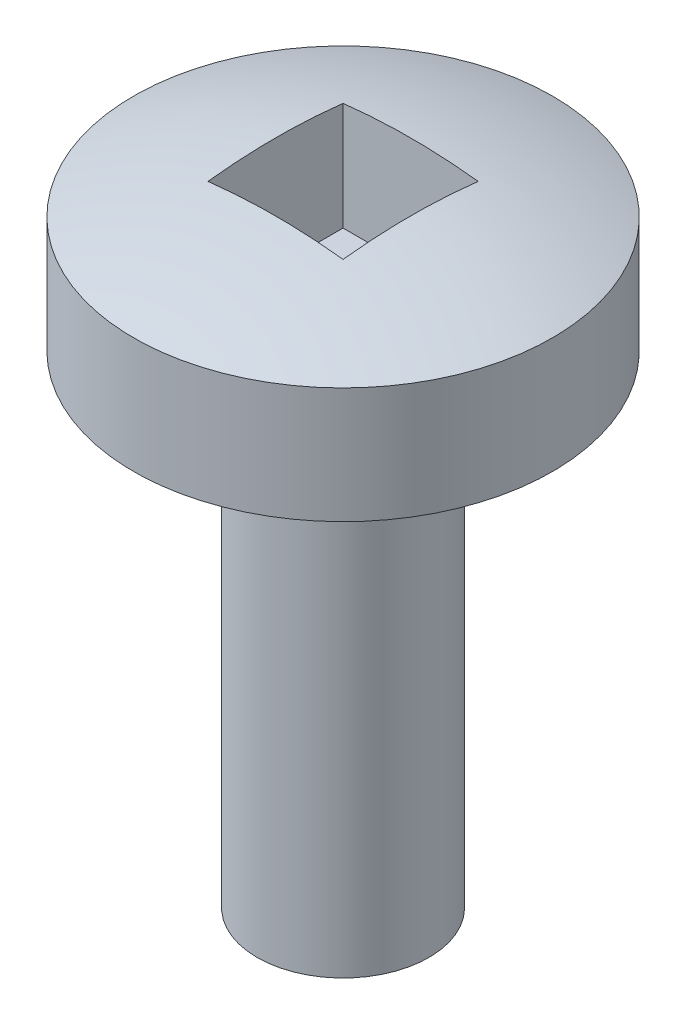
ISO-10303-21;
HEADER;
FILE_DESCRIPTION(('STEP AP214'),'2;1');
FILE_NAME('part.step','',(''),(''),'','','');
FILE_SCHEMA(('AUTOMOTIVE_DESIGN { 1 0 10303 214 1 1 1 1 }'));
ENDSEC;
DATA;
#1=APPLICATION_CONTEXT('core data for automotive mechanical design processes');
#2=APPLICATION_PROTOCOL_DEFINITION('international standard','automotive_design',2000,#1);
#3=PRODUCT_CONTEXT('',#1,'mechanical');
#4=PRODUCT('Part','Part','',(#3));
#5=PRODUCT_RELATED_PRODUCT_CATEGORY('part','',(#4));
#6=PRODUCT_DEFINITION_FORMATION('','',#4);
#7=PRODUCT_DEFINITION_CONTEXT('part definition',#1,'design');
#8=PRODUCT_DEFINITION('design','',#6,#7);
#9=PRODUCT_DEFINITION_SHAPE('','',#8);
#10=(LENGTH_UNIT() NAMED_UNIT(*) SI_UNIT(.MILLI.,.METRE.));
#11=(NAMED_UNIT(*) PLANE_ANGLE_UNIT() SI_UNIT($,.RADIAN.));
#12=(NAMED_UNIT(*) SI_UNIT($,.STERADIAN.) SOLID_ANGLE_UNIT());
#13=UNCERTAINTY_MEASURE_WITH_UNIT(LENGTH_MEASURE(1.E-05),#10,'distance_accuracy_value','');
#14=(GEOMETRIC_REPRESENTATION_CONTEXT(3) GLOBAL_UNCERTAINTY_ASSIGNED_CONTEXT((#13)) GLOBAL_UNIT_ASSIGNED_CONTEXT((#10,
#11,#12)) REPRESENTATION_CONTEXT('',''));
#15=CARTESIAN_POINT('',(0.,0.,0.));
#16=DIRECTION('',(0.,0.,1.));
#17=DIRECTION('',(1.,0.,0.));
#18=AXIS2_PLACEMENT_3D('',#15,#16,#17);
#19=CARTESIAN_POINT('',(0.,-6.35,0.));
#20=DIRECTION('',(0.,1.,0.));
#21=DIRECTION('',(0.,0.,1.));
#22=AXIS2_PLACEMENT_3D('',#19,#20,#21);
#23=CYLINDRICAL_SURFACE('',#22,1.1303);
#24=CARTESIAN_POINT('',(0.,-6.35,0.));
#25=DIRECTION('',(0.,1.,0.));
#26=DIRECTION('',(0.,0.,1.));
#27=AXIS2_PLACEMENT_3D('',#24,#25,#26);
#28=CIRCLE('',#27,1.1303);
#29=CARTESIAN_POINT('',(0.,-6.35,1.1303));
#30=VERTEX_POINT('',#29);
#31=EDGE_CURVE('E105',#30,#30,#28,.T.);
#32=ORIENTED_EDGE('',*,*,#31,.T.);
#33=EDGE_LOOP('',(#32));
#34=FACE_BOUND('',#33,.T.);
#35=CARTESIAN_POINT('',(0.,0.,0.));
#36=DIRECTION('',(0.,1.,0.));
#37=DIRECTION('',(0.,0.,1.));
#38=AXIS2_PLACEMENT_3D('',#35,#36,#37);
#39=CIRCLE('',#38,1.1303);
#40=CARTESIAN_POINT('',(0.,0.,1.1303));
#41=VERTEX_POINT('',#40);
#42=EDGE_CURVE('E109',#41,#41,#39,.T.);
#43=ORIENTED_EDGE('',*,*,#42,.F.);
#44=EDGE_LOOP('',(#43));
#45=FACE_BOUND('',#44,.T.);
#46=ADVANCED_FACE('F33',(#34,#45),#23,.T.);
#47=CARTESIAN_POINT('',(0.,-6.35,0.));
#48=DIRECTION('',(0.,1.,0.));
#49=DIRECTION('',(0.,0.,1.));
#50=AXIS2_PLACEMENT_3D('',#47,#48,#49);
#51=PLANE('',#50);
#52=ORIENTED_EDGE('',*,*,#31,.F.);
#53=EDGE_LOOP('',(#52));
#54=FACE_BOUND('',#53,.T.);
#55=ADVANCED_FACE('F129',(#54),#51,.F.);
#56=CARTESIAN_POINT('',(0.,1.524,0.));
#57=DIRECTION('',(0.,-1.,0.));
#58=DIRECTION('',(0.,0.,-1.));
#59=AXIS2_PLACEMENT_3D('',#56,#57,#58);
#60=CYLINDRICAL_SURFACE('',#59,2.7559);
#61=CARTESIAN_POINT('',(0.,1.524,0.));
#62=DIRECTION('',(0.,1.,0.));
#63=DIRECTION('',(0.,0.,1.));
#64=AXIS2_PLACEMENT_3D('',#61,#62,#63);
#65=CIRCLE('',#64,2.7559);
#66=CARTESIAN_POINT('',(0.,1.524,-2.7559));
#67=VERTEX_POINT('',#66);
#68=EDGE_CURVE('E104',#67,#67,#65,.T.);
#69=CARTESIAN_POINT('',(0.,0.,0.));
#70=DIRECTION('',(0.,1.,0.));
#71=DIRECTION('',(0.,0.,1.));
#72=AXIS2_PLACEMENT_3D('',#69,#70,#71);
#73=CIRCLE('',#72,2.7559);
#74=CARTESIAN_POINT('',(0.,0.,-2.7559));
#75=VERTEX_POINT('',#74);
#76=EDGE_CURVE('E98',#75,#75,#73,.T.);
#77=CARTESIAN_POINT('',(0.,1.524,-2.7559));
#78=CARTESIAN_POINT('',(0.,1.508125,-2.7559));
#79=CARTESIAN_POINT('',(0.,1.49225,-2.7559));
#80=CARTESIAN_POINT('',(0.,1.4605,-2.7559));
#81=CARTESIAN_POINT('',(0.,1.444625,-2.7559));
#82=CARTESIAN_POINT('',(0.,1.412875,-2.7559));
#83=CARTESIAN_POINT('',(0.,1.397,-2.7559));
#84=CARTESIAN_POINT('',(0.,1.36525,-2.7559));
#85=CARTESIAN_POINT('',(0.,1.349375,-2.7559));
#86=CARTESIAN_POINT('',(0.,1.317625,-2.7559));
#87=CARTESIAN_POINT('',(0.,1.30175,-2.7559));
#88=CARTESIAN_POINT('',(0.,1.27,-2.7559));
#89=CARTESIAN_POINT('',(0.,1.254125,-2.7559));
#90=CARTESIAN_POINT('',(0.,1.222375,-2.7559));
#91=CARTESIAN_POINT('',(0.,1.2065,-2.7559));
#92=CARTESIAN_POINT('',(0.,1.17475,-2.7559));
#93=CARTESIAN_POINT('',(0.,1.158875,-2.7559));
#94=CARTESIAN_POINT('',(0.,1.127125,-2.7559));
#95=CARTESIAN_POINT('',(0.,1.11125,-2.7559));
#96=CARTESIAN_POINT('',(0.,1.0795,-2.7559));
#97=CARTESIAN_POINT('',(0.,1.063625,-2.7559));
#98=CARTESIAN_POINT('',(0.,1.031875,-2.7559));
#99=CARTESIAN_POINT('',(0.,1.016,-2.7559));
#100=CARTESIAN_POINT('',(0.,0.98425,-2.7559));
#101=CARTESIAN_POINT('',(0.,0.968375,-2.7559));
#102=CARTESIAN_POINT('',(0.,0.936625,-2.7559));
#103=CARTESIAN_POINT('',(0.,0.92075,-2.7559));
#104=CARTESIAN_POINT('',(0.,0.889,-2.7559));
#105=CARTESIAN_POINT('',(0.,0.873125,-2.7559));
#106=CARTESIAN_POINT('',(0.,0.841375,-2.7559));
#107=CARTESIAN_POINT('',(0.,0.8255,-2.7559));
#108=CARTESIAN_POINT('',(0.,0.79375,-2.7559));
#109=CARTESIAN_POINT('',(0.,0.777875,-2.7559));
#110=CARTESIAN_POINT('',(0.,0.746125,-2.7559));
#111=CARTESIAN_POINT('',(0.,0.73025,-2.7559));
#112=CARTESIAN_POINT('',(0.,0.6985,-2.7559));
#113=CARTESIAN_POINT('',(0.,0.682625,-2.7559));
#114=CARTESIAN_POINT('',(0.,0.650875,-2.7559));
#115=CARTESIAN_POINT('',(0.,0.635,-2.7559));
#116=CARTESIAN_POINT('',(0.,0.60325,-2.7559));
#117=CARTESIAN_POINT('',(0.,0.587375,-2.7559));
#118=CARTESIAN_POINT('',(0.,0.555625,-2.7559));
#119=CARTESIAN_POINT('',(0.,0.53975,-2.7559));
#120=CARTESIAN_POINT('',(0.,0.508,-2.7559));
#121=CARTESIAN_POINT('',(0.,0.492125,-2.7559));
#122=CARTESIAN_POINT('',(0.,0.460375,-2.7559));
#123=CARTESIAN_POINT('',(0.,0.4445,-2.7559));
#124=CARTESIAN_POINT('',(0.,0.41275,-2.7559));
#125=CARTESIAN_POINT('',(0.,0.396875,-2.7559));
#126=CARTESIAN_POINT('',(0.,0.365125,-2.7559));
#127=CARTESIAN_POINT('',(0.,0.34925,-2.7559));
#128=CARTESIAN_POINT('',(0.,0.3175,-2.7559));
#129=CARTESIAN_POINT('',(0.,0.301625,-2.7559));
#130=CARTESIAN_POINT('',(0.,0.269875,-2.7559));
#131=CARTESIAN_POINT('',(0.,0.254,-2.7559));
#132=CARTESIAN_POINT('',(0.,0.22225,-2.7559));
#133=CARTESIAN_POINT('',(0.,0.206375,-2.7559));
#134=CARTESIAN_POINT('',(0.,0.174625,-2.7559));
#135=CARTESIAN_POINT('',(0.,0.15875,-2.7559));
#136=CARTESIAN_POINT('',(0.,0.127,-2.7559));
#137=CARTESIAN_POINT('',(0.,0.111125,-2.7559));
#138=CARTESIAN_POINT('',(0.,0.079375,-2.7559));
#139=CARTESIAN_POINT('',(0.,0.0635,-2.7559));
#140=CARTESIAN_POINT('',(0.,0.0317499999999999,-2.7559));
#141=CARTESIAN_POINT('',(0.,0.015875,-2.7559));
#142=CARTESIAN_POINT('',(0.,0.,-2.7559));
#143=B_SPLINE_CURVE_WITH_KNOTS('',3,(#77,#78,#79,#80,#81,#82,#83,#84,#85,#86,#87,#88,#89,#90,
#91,#92,#93,#94,#95,#96,#97,#98,#99,#100,#101,#102,#103,#104,#105,#106,#107,#108,#109,#110,#111,
#112,#113,#114,#115,#116,#117,#118,#119,#120,#121,#122,#123,#124,#125,#126,#127,#128,#129,#130,
#131,#132,#133,#134,#135,#136,#137,#138,#139,#140,#141,#142),.UNSPECIFIED.,.F.,.F.,(4,2,2,2,2,2,
2,2,2,2,2,2,2,2,2,2,2,2,2,2,2,2,2,2,2,2,2,2,2,2,2,2,4),(0.,0.0476250000000001,
0.0952500000000001,0.142875,0.1905,0.238125,0.28575,0.333375,0.381,0.428625,0.47625,0.523875,
0.5715,0.619125,0.66675,0.714375,0.762,0.809625,0.85725,0.904875,0.9525,1.000125,1.04775,
1.095375,1.143,1.190625,1.23825,1.285875,1.3335,1.381125,1.42875,1.476375,1.524),.UNSPECIFIED.);
#144=EDGE_CURVE('BSEAM124',#67,#75,#143,.T.);
#145=ORIENTED_EDGE('',*,*,#68,.F.);
#146=ORIENTED_EDGE('',*,*,#76,.T.);
#147=ORIENTED_EDGE('',*,*,#144,.T.);
#148=ORIENTED_EDGE('',*,*,#144,.F.);
#149=EDGE_LOOP('',(#145,#147,#146,#148));
#150=FACE_BOUND('',#149,.T.);
#151=ADVANCED_FACE('F124',(#150),#60,.T.);
#152=CARTESIAN_POINT('',(0.,-5.69737875,0.));
#153=DIRECTION('',(0.,0.,1.));
#154=DIRECTION('',(1.,0.,0.));
#155=AXIS2_PLACEMENT_3D('',#152,#153,#154);
#156=SPHERICAL_SURFACE('',#155,7.72937875);
#157=CARTESIAN_POINT('',(0.889,-5.69737875,0.));
#158=DIRECTION('',(1.,0.,0.));
#159=DIRECTION('',(0.,0.,-1.));
#160=AXIS2_PLACEMENT_3D('',#157,#158,#159);
#161=CIRCLE('',#160,7.67808406185759);
#162=CARTESIAN_POINT('',(0.889,1.92906562867028,0.889));
#163=VERTEX_POINT('',#162);
#164=CARTESIAN_POINT('',(0.889,1.92906562867028,-0.889));
#165=VERTEX_POINT('',#164);
#166=EDGE_CURVE('E11',#163,#165,#161,.F.);
#167=ORIENTED_EDGE('',*,*,#166,.F.);
#168=CARTESIAN_POINT('',(0.,-5.69737875,0.889));
#169=DIRECTION('',(0.,0.,1.));
#170=DIRECTION('',(1.,0.,0.));
#171=AXIS2_PLACEMENT_3D('',#168,#169,#170);
#172=CIRCLE('',#171,7.67808406185759);
#173=CARTESIAN_POINT('',(-0.889,1.92906562867028,0.888999999999999));
#174=VERTEX_POINT('',#173);
#175=EDGE_CURVE('E41',#174,#163,#172,.F.);
#176=ORIENTED_EDGE('',*,*,#175,.F.);
#177=CARTESIAN_POINT('',(-0.889,-5.69737875,0.));
#178=DIRECTION('',(-1.,0.,0.));
#179=DIRECTION('',(0.,0.,1.));
#180=AXIS2_PLACEMENT_3D('',#177,#178,#179);
#181=CIRCLE('',#180,7.67808406185759);
#182=CARTESIAN_POINT('',(-0.888999999999999,1.92906562867028,-0.889));
#183=VERTEX_POINT('',#182);
#184=EDGE_CURVE('E115',#183,#174,#181,.F.);
#185=ORIENTED_EDGE('',*,*,#184,.F.);
#186=CARTESIAN_POINT('',(0.,-5.69737875,-0.889));
#187=DIRECTION('',(0.,0.,-1.));
#188=DIRECTION('',(-1.,0.,0.));
#189=AXIS2_PLACEMENT_3D('',#186,#187,#188);
#190=CIRCLE('',#189,7.67808406185759);
#191=EDGE_CURVE('E108',#165,#183,#190,.F.);
#192=ORIENTED_EDGE('',*,*,#191,.F.);
#193=EDGE_LOOP('',(#167,#176,#185,#192));
#194=FACE_BOUND('',#193,.T.);
#195=ORIENTED_EDGE('',*,*,#68,.T.);
#196=EDGE_LOOP('',(#195));
#197=FACE_BOUND('',#196,.T.);
#198=ADVANCED_FACE('F35',(#194,#197),#156,.T.);
#199=CARTESIAN_POINT('',(0.,0.,0.));
#200=DIRECTION('',(0.,1.,0.));
#201=DIRECTION('',(0.,0.,1.));
#202=AXIS2_PLACEMENT_3D('',#199,#200,#201);
#203=PLANE('',#202);
#204=ORIENTED_EDGE('',*,*,#42,.T.);
#205=EDGE_LOOP('',(#204));
#206=FACE_BOUND('',#205,.T.);
#207=ORIENTED_EDGE('',*,*,#76,.F.);
#208=EDGE_LOOP('',(#207));
#209=FACE_BOUND('',#208,.T.);
#210=ADVANCED_FACE('F123',(#206,#209),#203,.F.);
#211=CARTESIAN_POINT('',(0.889,0.508,0.889));
#212=DIRECTION('',(1.,0.,0.));
#213=DIRECTION('',(0.,0.,-1.));
#214=AXIS2_PLACEMENT_3D('',#211,#212,#213);
#215=PLANE('',#214);
#216=ORIENTED_EDGE('',*,*,#166,.T.);
#217=DIRECTION('',(0.,1.,0.));
#218=VECTOR('',#217,1.);
#219=CARTESIAN_POINT('',(0.889,0.508,-0.889));
#220=LINE('',#219,#218);
#221=CARTESIAN_POINT('',(0.889,0.508,-0.889));
#222=VERTEX_POINT('',#221);
#223=EDGE_CURVE('E48',#222,#165,#220,.T.);
#224=ORIENTED_EDGE('',*,*,#223,.F.);
#225=DIRECTION('',(0.,0.,-1.));
#226=VECTOR('',#225,1.);
#227=CARTESIAN_POINT('',(0.889,0.508,0.889));
#228=LINE('',#227,#226);
#229=CARTESIAN_POINT('',(0.889,0.508,0.889));
#230=VERTEX_POINT('',#229);
#231=EDGE_CURVE('E74',#230,#222,#228,.T.);
#232=ORIENTED_EDGE('',*,*,#231,.F.);
#233=DIRECTION('',(0.,1.,0.));
#234=VECTOR('',#233,1.);
#235=CARTESIAN_POINT('',(0.889,0.508,0.889));
#236=LINE('',#235,#234);
#237=EDGE_CURVE('E96',#230,#163,#236,.T.);
#238=ORIENTED_EDGE('',*,*,#237,.T.);
#239=EDGE_LOOP('',(#216,#224,#232,#238));
#240=FACE_BOUND('',#239,.T.);
#241=ADVANCED_FACE('F72',(#240),#215,.F.);
#242=CARTESIAN_POINT('',(-0.889,0.508,0.889));
#243=DIRECTION('',(0.,0.,1.));
#244=DIRECTION('',(1.,0.,0.));
#245=AXIS2_PLACEMENT_3D('',#242,#243,#244);
#246=PLANE('',#245);
#247=ORIENTED_EDGE('',*,*,#175,.T.);
#248=ORIENTED_EDGE('',*,*,#237,.F.);
#249=DIRECTION('',(1.,0.,0.));
#250=VECTOR('',#249,1.);
#251=CARTESIAN_POINT('',(-0.889,0.508,0.889));
#252=LINE('',#251,#250);
#253=CARTESIAN_POINT('',(-0.889,0.508,0.889));
#254=VERTEX_POINT('',#253);
#255=EDGE_CURVE('E79',#254,#230,#252,.T.);
#256=ORIENTED_EDGE('',*,*,#255,.F.);
#257=DIRECTION('',(0.,1.,0.));
#258=VECTOR('',#257,1.);
#259=CARTESIAN_POINT('',(-0.889,0.508,0.889));
#260=LINE('',#259,#258);
#261=EDGE_CURVE('E99',#254,#174,#260,.T.);
#262=ORIENTED_EDGE('',*,*,#261,.T.);
#263=EDGE_LOOP('',(#247,#248,#256,#262));
#264=FACE_BOUND('',#263,.T.);
#265=ADVANCED_FACE('F120',(#264),#246,.F.);
#266=CARTESIAN_POINT('',(-0.889,0.508,0.889));
#267=DIRECTION('',(-1.,0.,0.));
#268=DIRECTION('',(0.,0.,1.));
#269=AXIS2_PLACEMENT_3D('',#266,#267,#268);
#270=PLANE('',#269);
#271=ORIENTED_EDGE('',*,*,#184,.T.);
#272=ORIENTED_EDGE('',*,*,#261,.F.);
#273=DIRECTION('',(0.,0.,1.));
#274=VECTOR('',#273,1.);
#275=CARTESIAN_POINT('',(-0.889,0.508,0.889));
#276=LINE('',#275,#274);
#277=CARTESIAN_POINT('',(-0.889,0.508,-0.889));
#278=VERTEX_POINT('',#277);
#279=EDGE_CURVE('E88',#278,#254,#276,.T.);
#280=ORIENTED_EDGE('',*,*,#279,.F.);
#281=DIRECTION('',(0.,1.,0.));
#282=VECTOR('',#281,1.);
#283=CARTESIAN_POINT('',(-0.889,0.508,-0.889));
#284=LINE('',#283,#282);
#285=EDGE_CURVE('E78',#278,#183,#284,.T.);
#286=ORIENTED_EDGE('',*,*,#285,.T.);
#287=EDGE_LOOP('',(#271,#272,#280,#286));
#288=FACE_BOUND('',#287,.T.);
#289=ADVANCED_FACE('F118',(#288),#270,.F.);
#290=CARTESIAN_POINT('',(-0.889,0.508,-0.889));
#291=DIRECTION('',(0.,0.,-1.));
#292=DIRECTION('',(-1.,0.,0.));
#293=AXIS2_PLACEMENT_3D('',#290,#291,#292);
#294=PLANE('',#293);
#295=ORIENTED_EDGE('',*,*,#191,.T.);
#296=ORIENTED_EDGE('',*,*,#285,.F.);
#297=DIRECTION('',(-1.,0.,0.));
#298=VECTOR('',#297,1.);
#299=CARTESIAN_POINT('',(-0.889,0.508,-0.889));
#300=LINE('',#299,#298);
#301=EDGE_CURVE('E82',#222,#278,#300,.T.);
#302=ORIENTED_EDGE('',*,*,#301,.F.);
#303=ORIENTED_EDGE('',*,*,#223,.T.);
#304=EDGE_LOOP('',(#295,#296,#302,#303));
#305=FACE_BOUND('',#304,.T.);
#306=ADVANCED_FACE('F83',(#305),#294,.F.);
#307=CARTESIAN_POINT('',(0.,0.508,0.));
#308=DIRECTION('',(0.,-1.,0.));
#309=DIRECTION('',(0.,0.,-1.));
#310=AXIS2_PLACEMENT_3D('',#307,#308,#309);
#311=PLANE('',#310);
#312=ORIENTED_EDGE('',*,*,#231,.T.);
#313=ORIENTED_EDGE('',*,*,#301,.T.);
#314=ORIENTED_EDGE('',*,*,#279,.T.);
#315=ORIENTED_EDGE('',*,*,#255,.T.);
#316=EDGE_LOOP('',(#312,#313,#314,#315));
#317=FACE_BOUND('',#316,.T.);
#318=ADVANCED_FACE('F90',(#317),#311,.F.);
#319=CLOSED_SHELL('',(#46,#55,#151,#198,#210,#241,#265,#289,#306,#318));
#320=MANIFOLD_SOLID_BREP('B2',#319);
#321=ADVANCED_BREP_SHAPE_REPRESENTATION('',(#18,#320),#14);
#322=SHAPE_DEFINITION_REPRESENTATION(#9,#321);
ENDSEC;
END-ISO-10303-21;
